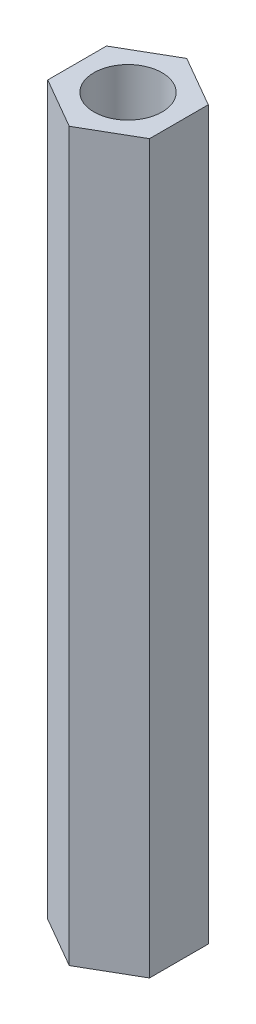
ISO-10303-21;
HEADER;
FILE_DESCRIPTION(('STEP AP214'),'2;1');
FILE_NAME('part.step','',(''),(''),'','','');
FILE_SCHEMA(('AUTOMOTIVE_DESIGN { 1 0 10303 214 1 1 1 1 }'));
ENDSEC;
DATA;
#1=APPLICATION_CONTEXT('core data for automotive mechanical design processes');
#2=APPLICATION_PROTOCOL_DEFINITION('international standard','automotive_design',2000,#1);
#3=PRODUCT_CONTEXT('',#1,'mechanical');
#4=PRODUCT('Part','Part','',(#3));
#5=PRODUCT_RELATED_PRODUCT_CATEGORY('part','',(#4));
#6=PRODUCT_DEFINITION_FORMATION('','',#4);
#7=PRODUCT_DEFINITION_CONTEXT('part definition',#1,'design');
#8=PRODUCT_DEFINITION('design','',#6,#7);
#9=PRODUCT_DEFINITION_SHAPE('','',#8);
#10=(LENGTH_UNIT() NAMED_UNIT(*) SI_UNIT(.MILLI.,.METRE.));
#11=(NAMED_UNIT(*) PLANE_ANGLE_UNIT() SI_UNIT($,.RADIAN.));
#12=(NAMED_UNIT(*) SI_UNIT($,.STERADIAN.) SOLID_ANGLE_UNIT());
#13=UNCERTAINTY_MEASURE_WITH_UNIT(LENGTH_MEASURE(1.E-05),#10,'distance_accuracy_value','');
#14=(GEOMETRIC_REPRESENTATION_CONTEXT(3) GLOBAL_UNCERTAINTY_ASSIGNED_CONTEXT((#13)) GLOBAL_UNIT_ASSIGNED_CONTEXT((#10,
#11,#12)) REPRESENTATION_CONTEXT('',''));
#15=CARTESIAN_POINT('',(0.,0.,0.));
#16=DIRECTION('',(0.,0.,1.));
#17=DIRECTION('',(1.,0.,0.));
#18=AXIS2_PLACEMENT_3D('',#15,#16,#17);
#19=CARTESIAN_POINT('',(0.,25.4,0.));
#20=DIRECTION('',(0.,1.,0.));
#21=DIRECTION('',(0.,0.,1.));
#22=AXIS2_PLACEMENT_3D('',#19,#20,#21);
#23=PLANE('',#22);
#24=DIRECTION('',(0.866025403784438,0.,0.5));
#25=VECTOR('',#24,1.);
#26=CARTESIAN_POINT('',(-1.778,25.4,1.02652877861915));
#27=LINE('',#26,#25);
#28=CARTESIAN_POINT('',(-1.778,25.4,1.02652877861915));
#29=VERTEX_POINT('',#28);
#30=CARTESIAN_POINT('',(0.,25.4,2.05305755723831));
#31=VERTEX_POINT('',#30);
#32=EDGE_CURVE('E129',#29,#31,#27,.T.);
#33=ORIENTED_EDGE('',*,*,#32,.T.);
#34=DIRECTION('',(0.866025403784439,0.,-0.5));
#35=VECTOR('',#34,1.);
#36=CARTESIAN_POINT('',(0.,25.4,2.05305755723831));
#37=LINE('',#36,#35);
#38=CARTESIAN_POINT('',(1.778,25.4,1.02652877861915));
#39=VERTEX_POINT('',#38);
#40=EDGE_CURVE('E87',#31,#39,#37,.T.);
#41=ORIENTED_EDGE('',*,*,#40,.T.);
#42=DIRECTION('',(0.,0.,-1.));
#43=VECTOR('',#42,1.);
#44=CARTESIAN_POINT('',(1.778,25.4,1.02652877861915));
#45=LINE('',#44,#43);
#46=CARTESIAN_POINT('',(1.778,25.4,-1.02652877861915));
#47=VERTEX_POINT('',#46);
#48=EDGE_CURVE('E100',#39,#47,#45,.T.);
#49=ORIENTED_EDGE('',*,*,#48,.T.);
#50=DIRECTION('',(-0.866025403784439,0.,-0.5));
#51=VECTOR('',#50,1.);
#52=CARTESIAN_POINT('',(1.778,25.4,-1.02652877861915));
#53=LINE('',#52,#51);
#54=CARTESIAN_POINT('',(0.,25.4,-2.05305755723831));
#55=VERTEX_POINT('',#54);
#56=EDGE_CURVE('E94',#47,#55,#53,.T.);
#57=ORIENTED_EDGE('',*,*,#56,.T.);
#58=DIRECTION('',(-0.866025403784439,0.,0.5));
#59=VECTOR('',#58,1.);
#60=CARTESIAN_POINT('',(0.,25.4,-2.05305755723831));
#61=LINE('',#60,#59);
#62=CARTESIAN_POINT('',(-1.778,25.4,-1.02652877861915));
#63=VERTEX_POINT('',#62);
#64=EDGE_CURVE('E98',#55,#63,#61,.T.);
#65=ORIENTED_EDGE('',*,*,#64,.T.);
#66=DIRECTION('',(0.,0.,1.));
#67=VECTOR('',#66,1.);
#68=CARTESIAN_POINT('',(-1.778,25.4,-1.02652877861915));
#69=LINE('',#68,#67);
#70=EDGE_CURVE('E50',#63,#29,#69,.T.);
#71=ORIENTED_EDGE('',*,*,#70,.T.);
#72=EDGE_LOOP('',(#33,#41,#49,#57,#65,#71));
#73=FACE_BOUND('',#72,.T.);
#74=CARTESIAN_POINT('',(0.,25.4,0.));
#75=DIRECTION('',(0.,1.,0.));
#76=DIRECTION('',(0.,0.,1.));
#77=AXIS2_PLACEMENT_3D('',#74,#75,#76);
#78=CIRCLE('',#77,1.190625);
#79=CARTESIAN_POINT('',(0.,25.4,1.190625));
#80=VERTEX_POINT('',#79);
#81=EDGE_CURVE('E122',#80,#80,#78,.T.);
#82=ORIENTED_EDGE('',*,*,#81,.F.);
#83=EDGE_LOOP('',(#82));
#84=FACE_BOUND('',#83,.T.);
#85=ADVANCED_FACE('F33',(#73,#84),#23,.T.);
#86=CARTESIAN_POINT('',(0.,0.,0.));
#87=DIRECTION('',(0.,1.,0.));
#88=DIRECTION('',(0.,0.,1.));
#89=AXIS2_PLACEMENT_3D('',#86,#87,#88);
#90=PLANE('',#89);
#91=DIRECTION('',(0.866025403784438,0.,0.5));
#92=VECTOR('',#91,1.);
#93=CARTESIAN_POINT('',(-1.778,0.,1.02652877861915));
#94=LINE('',#93,#92);
#95=CARTESIAN_POINT('',(-1.778,0.,1.02652877861915));
#96=VERTEX_POINT('',#95);
#97=CARTESIAN_POINT('',(0.,0.,2.05305755723831));
#98=VERTEX_POINT('',#97);
#99=EDGE_CURVE('E118',#96,#98,#94,.T.);
#100=ORIENTED_EDGE('',*,*,#99,.F.);
#101=DIRECTION('',(0.,0.,1.));
#102=VECTOR('',#101,1.);
#103=CARTESIAN_POINT('',(-1.778,0.,-1.02652877861915));
#104=LINE('',#103,#102);
#105=CARTESIAN_POINT('',(-1.778,0.,-1.02652877861915));
#106=VERTEX_POINT('',#105);
#107=EDGE_CURVE('E79',#106,#96,#104,.T.);
#108=ORIENTED_EDGE('',*,*,#107,.F.);
#109=DIRECTION('',(-0.866025403784439,0.,0.5));
#110=VECTOR('',#109,1.);
#111=CARTESIAN_POINT('',(0.,0.,-2.05305755723831));
#112=LINE('',#111,#110);
#113=CARTESIAN_POINT('',(0.,0.,-2.05305755723831));
#114=VERTEX_POINT('',#113);
#115=EDGE_CURVE('E73',#114,#106,#112,.T.);
#116=ORIENTED_EDGE('',*,*,#115,.F.);
#117=DIRECTION('',(-0.866025403784439,0.,-0.5));
#118=VECTOR('',#117,1.);
#119=CARTESIAN_POINT('',(1.778,0.,-1.02652877861915));
#120=LINE('',#119,#118);
#121=CARTESIAN_POINT('',(1.778,0.,-1.02652877861915));
#122=VERTEX_POINT('',#121);
#123=EDGE_CURVE('E108',#122,#114,#120,.T.);
#124=ORIENTED_EDGE('',*,*,#123,.F.);
#125=DIRECTION('',(0.,0.,-1.));
#126=VECTOR('',#125,1.);
#127=CARTESIAN_POINT('',(1.778,0.,1.02652877861915));
#128=LINE('',#127,#126);
#129=CARTESIAN_POINT('',(1.778,0.,1.02652877861915));
#130=VERTEX_POINT('',#129);
#131=EDGE_CURVE('E124',#130,#122,#128,.T.);
#132=ORIENTED_EDGE('',*,*,#131,.F.);
#133=DIRECTION('',(0.866025403784439,0.,-0.5));
#134=VECTOR('',#133,1.);
#135=CARTESIAN_POINT('',(0.,0.,2.05305755723831));
#136=LINE('',#135,#134);
#137=EDGE_CURVE('E121',#98,#130,#136,.T.);
#138=ORIENTED_EDGE('',*,*,#137,.F.);
#139=EDGE_LOOP('',(#100,#108,#116,#124,#132,#138));
#140=FACE_BOUND('',#139,.T.);
#141=CARTESIAN_POINT('',(0.,0.,0.));
#142=DIRECTION('',(0.,1.,0.));
#143=DIRECTION('',(0.,0.,1.));
#144=AXIS2_PLACEMENT_3D('',#141,#142,#143);
#145=CIRCLE('',#144,1.190625);
#146=CARTESIAN_POINT('',(0.,0.,1.190625));
#147=VERTEX_POINT('',#146);
#148=EDGE_CURVE('E222',#147,#147,#145,.T.);
#149=ORIENTED_EDGE('',*,*,#148,.T.);
#150=EDGE_LOOP('',(#149));
#151=FACE_BOUND('',#150,.T.);
#152=ADVANCED_FACE('F138',(#140,#151),#90,.F.);
#153=CARTESIAN_POINT('',(-1.778,25.4,1.02652877861915));
#154=DIRECTION('',(0.5,0.,-0.866025403784438));
#155=DIRECTION('',(-0.866025403784439,0.,-0.5));
#156=AXIS2_PLACEMENT_3D('',#153,#154,#155);
#157=PLANE('',#156);
#158=ORIENTED_EDGE('',*,*,#99,.T.);
#159=DIRECTION('',(0.,-1.,0.));
#160=VECTOR('',#159,1.);
#161=CARTESIAN_POINT('',(0.,25.4,2.05305755723831));
#162=LINE('',#161,#160);
#163=EDGE_CURVE('E11',#31,#98,#162,.T.);
#164=ORIENTED_EDGE('',*,*,#163,.F.);
#165=ORIENTED_EDGE('',*,*,#32,.F.);
#166=DIRECTION('',(0.,-1.,0.));
#167=VECTOR('',#166,1.);
#168=CARTESIAN_POINT('',(-1.778,25.4,1.02652877861915));
#169=LINE('',#168,#167);
#170=EDGE_CURVE('E114',#29,#96,#169,.T.);
#171=ORIENTED_EDGE('',*,*,#170,.T.);
#172=EDGE_LOOP('',(#158,#164,#165,#171));
#173=FACE_BOUND('',#172,.T.);
#174=ADVANCED_FACE('F35',(#173),#157,.F.);
#175=CARTESIAN_POINT('',(0.,25.4,2.05305755723831));
#176=DIRECTION('',(-0.5,0.,-0.866025403784439));
#177=DIRECTION('',(-0.866025403784439,0.,0.5));
#178=AXIS2_PLACEMENT_3D('',#175,#176,#177);
#179=PLANE('',#178);
#180=ORIENTED_EDGE('',*,*,#137,.T.);
#181=DIRECTION('',(0.,-1.,0.));
#182=VECTOR('',#181,1.);
#183=CARTESIAN_POINT('',(1.778,25.4,1.02652877861915));
#184=LINE('',#183,#182);
#185=EDGE_CURVE('E42',#39,#130,#184,.T.);
#186=ORIENTED_EDGE('',*,*,#185,.F.);
#187=ORIENTED_EDGE('',*,*,#40,.F.);
#188=ORIENTED_EDGE('',*,*,#163,.T.);
#189=EDGE_LOOP('',(#180,#186,#187,#188));
#190=FACE_BOUND('',#189,.T.);
#191=ADVANCED_FACE('F163',(#190),#179,.F.);
#192=CARTESIAN_POINT('',(1.778,25.4,1.02652877861915));
#193=DIRECTION('',(-1.,0.,0.));
#194=DIRECTION('',(0.,0.,1.));
#195=AXIS2_PLACEMENT_3D('',#192,#193,#194);
#196=PLANE('',#195);
#197=ORIENTED_EDGE('',*,*,#131,.T.);
#198=DIRECTION('',(0.,-1.,0.));
#199=VECTOR('',#198,1.);
#200=CARTESIAN_POINT('',(1.778,25.4,-1.02652877861915));
#201=LINE('',#200,#199);
#202=EDGE_CURVE('E109',#47,#122,#201,.T.);
#203=ORIENTED_EDGE('',*,*,#202,.F.);
#204=ORIENTED_EDGE('',*,*,#48,.F.);
#205=ORIENTED_EDGE('',*,*,#185,.T.);
#206=EDGE_LOOP('',(#197,#203,#204,#205));
#207=FACE_BOUND('',#206,.T.);
#208=ADVANCED_FACE('F135',(#207),#196,.F.);
#209=CARTESIAN_POINT('',(1.778,25.4,-1.02652877861915));
#210=DIRECTION('',(-0.5,0.,0.866025403784439));
#211=DIRECTION('',(0.866025403784439,0.,0.5));
#212=AXIS2_PLACEMENT_3D('',#209,#210,#211);
#213=PLANE('',#212);
#214=ORIENTED_EDGE('',*,*,#123,.T.);
#215=DIRECTION('',(0.,-1.,0.));
#216=VECTOR('',#215,1.);
#217=CARTESIAN_POINT('',(0.,25.4,-2.05305755723831));
#218=LINE('',#217,#216);
#219=EDGE_CURVE('E105',#55,#114,#218,.T.);
#220=ORIENTED_EDGE('',*,*,#219,.F.);
#221=ORIENTED_EDGE('',*,*,#56,.F.);
#222=ORIENTED_EDGE('',*,*,#202,.T.);
#223=EDGE_LOOP('',(#214,#220,#221,#222));
#224=FACE_BOUND('',#223,.T.);
#225=ADVANCED_FACE('F106',(#224),#213,.F.);
#226=CARTESIAN_POINT('',(0.,25.4,-2.05305755723831));
#227=DIRECTION('',(0.5,0.,0.866025403784439));
#228=DIRECTION('',(0.866025403784439,0.,-0.5));
#229=AXIS2_PLACEMENT_3D('',#226,#227,#228);
#230=PLANE('',#229);
#231=ORIENTED_EDGE('',*,*,#115,.T.);
#232=DIRECTION('',(0.,-1.,0.));
#233=VECTOR('',#232,1.);
#234=CARTESIAN_POINT('',(-1.778,25.4,-1.02652877861915));
#235=LINE('',#234,#233);
#236=EDGE_CURVE('E110',#63,#106,#235,.T.);
#237=ORIENTED_EDGE('',*,*,#236,.F.);
#238=ORIENTED_EDGE('',*,*,#64,.F.);
#239=ORIENTED_EDGE('',*,*,#219,.T.);
#240=EDGE_LOOP('',(#231,#237,#238,#239));
#241=FACE_BOUND('',#240,.T.);
#242=ADVANCED_FACE('F112',(#241),#230,.F.);
#243=CARTESIAN_POINT('',(-1.778,25.4,-1.02652877861915));
#244=DIRECTION('',(1.,0.,0.));
#245=DIRECTION('',(0.,0.,-1.));
#246=AXIS2_PLACEMENT_3D('',#243,#244,#245);
#247=PLANE('',#246);
#248=ORIENTED_EDGE('',*,*,#107,.T.);
#249=ORIENTED_EDGE('',*,*,#170,.F.);
#250=ORIENTED_EDGE('',*,*,#70,.F.);
#251=ORIENTED_EDGE('',*,*,#236,.T.);
#252=EDGE_LOOP('',(#248,#249,#250,#251));
#253=FACE_BOUND('',#252,.T.);
#254=ADVANCED_FACE('F143',(#253),#247,.F.);
#255=CARTESIAN_POINT('',(0.,25.4,0.));
#256=DIRECTION('',(0.,-1.,0.));
#257=DIRECTION('',(0.,0.,-1.));
#258=AXIS2_PLACEMENT_3D('',#255,#256,#257);
#259=CYLINDRICAL_SURFACE('',#258,1.190625);
#260=ORIENTED_EDGE('',*,*,#81,.T.);
#261=EDGE_LOOP('',(#260));
#262=FACE_BOUND('',#261,.T.);
#263=ORIENTED_EDGE('',*,*,#148,.F.);
#264=EDGE_LOOP('',(#263));
#265=FACE_BOUND('',#264,.T.);
#266=ADVANCED_FACE('F145',(#262,#265),#259,.F.);
#267=CLOSED_SHELL('',(#85,#152,#174,#191,#208,#225,#242,#254,#266));
#268=MANIFOLD_SOLID_BREP('B2',#267);
#269=ADVANCED_BREP_SHAPE_REPRESENTATION('',(#18,#268),#14);
#270=SHAPE_DEFINITION_REPRESENTATION(#9,#269);
ENDSEC;
END-ISO-10303-21;
